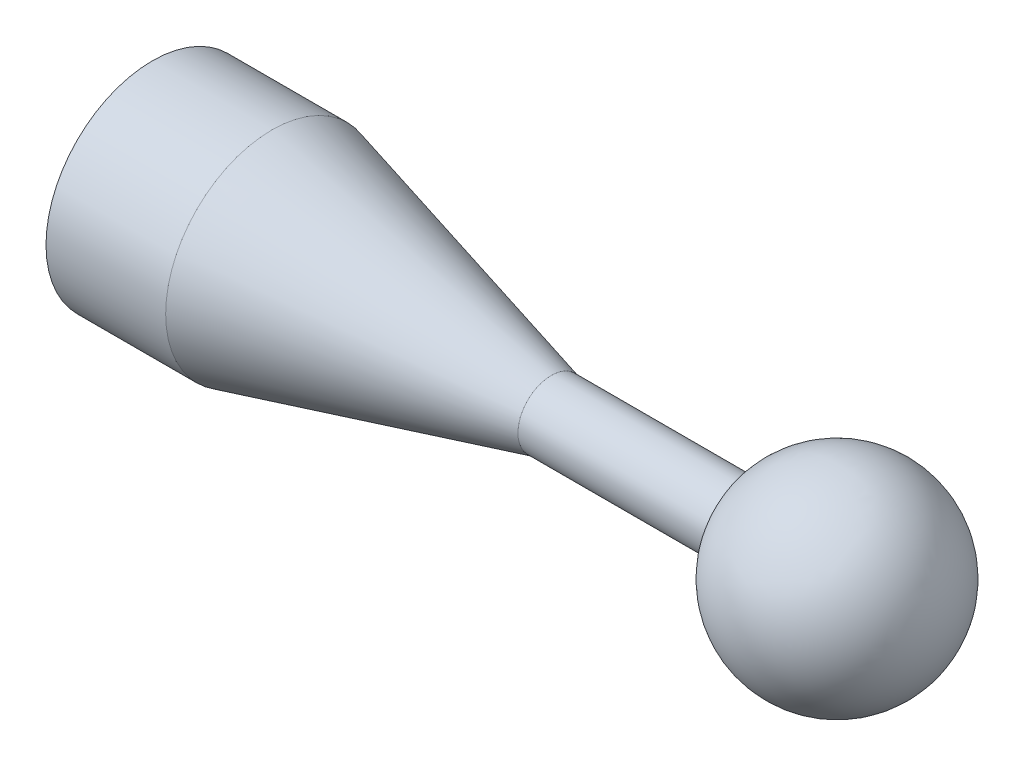
ISO-10303-21;
HEADER;
FILE_DESCRIPTION(('STEP AP214'),'2;1');
FILE_NAME('part.step','',(''),(''),'','','');
FILE_SCHEMA(('AUTOMOTIVE_DESIGN { 1 0 10303 214 1 1 1 1 }'));
ENDSEC;
DATA;
#1=APPLICATION_CONTEXT('core data for automotive mechanical design processes');
#2=APPLICATION_PROTOCOL_DEFINITION('international standard','automotive_design',2000,#1);
#3=PRODUCT_CONTEXT('',#1,'mechanical');
#4=PRODUCT('Part','Part','',(#3));
#5=PRODUCT_RELATED_PRODUCT_CATEGORY('part','',(#4));
#6=PRODUCT_DEFINITION_FORMATION('','',#4);
#7=PRODUCT_DEFINITION_CONTEXT('part definition',#1,'design');
#8=PRODUCT_DEFINITION('design','',#6,#7);
#9=PRODUCT_DEFINITION_SHAPE('','',#8);
#10=(LENGTH_UNIT() NAMED_UNIT(*) SI_UNIT(.MILLI.,.METRE.));
#11=(NAMED_UNIT(*) PLANE_ANGLE_UNIT() SI_UNIT($,.RADIAN.));
#12=(NAMED_UNIT(*) SI_UNIT($,.STERADIAN.) SOLID_ANGLE_UNIT());
#13=UNCERTAINTY_MEASURE_WITH_UNIT(LENGTH_MEASURE(1.E-05),#10,'distance_accuracy_value','');
#14=(GEOMETRIC_REPRESENTATION_CONTEXT(3) GLOBAL_UNCERTAINTY_ASSIGNED_CONTEXT((#13)) GLOBAL_UNIT_ASSIGNED_CONTEXT((#10,
#11,#12)) REPRESENTATION_CONTEXT('',''));
#15=CARTESIAN_POINT('',(0.,0.,0.));
#16=DIRECTION('',(0.,0.,1.));
#17=DIRECTION('',(1.,0.,0.));
#18=AXIS2_PLACEMENT_3D('',#15,#16,#17);
#19=CARTESIAN_POINT('',(103.,0.,0.));
#20=DIRECTION('',(-1.,0.,0.));
#21=DIRECTION('',(0.,1.,0.));
#22=AXIS2_PLACEMENT_3D('',#19,#20,#21);
#23=SPHERICAL_SURFACE('',#22,15.);
#24=CARTESIAN_POINT('',(88.857864376269,0.,0.));
#25=DIRECTION('',(-1.,0.,0.));
#26=DIRECTION('',(0.,0.,1.));
#27=AXIS2_PLACEMENT_3D('',#24,#25,#26);
#28=CIRCLE('',#27,5.);
#29=CARTESIAN_POINT('',(88.857864376269,0.,5.));
#30=VERTEX_POINT('',#29);
#31=EDGE_CURVE('E10',#30,#30,#28,.T.);
#32=ORIENTED_EDGE('',*,*,#31,.F.);
#33=EDGE_LOOP('',(#32));
#34=FACE_BOUND('',#33,.T.);
#35=ADVANCED_FACE('F29',(#34),#23,.T.);
#36=CARTESIAN_POINT('',(-11.8977150537634,0.,0.));
#37=DIRECTION('',(-1.,0.,0.));
#38=DIRECTION('',(0.,0.,1.));
#39=AXIS2_PLACEMENT_3D('',#36,#37,#38);
#40=CYLINDRICAL_SURFACE('',#39,5.);
#41=CARTESIAN_POINT('',(60.,0.,0.));
#42=DIRECTION('',(-1.,0.,0.));
#43=DIRECTION('',(0.,0.,1.));
#44=AXIS2_PLACEMENT_3D('',#41,#42,#43);
#45=CIRCLE('',#44,5.);
#46=CARTESIAN_POINT('',(60.,0.,5.));
#47=VERTEX_POINT('',#46);
#48=EDGE_CURVE('E35',#47,#47,#45,.T.);
#49=ORIENTED_EDGE('',*,*,#48,.F.);
#50=EDGE_LOOP('',(#49));
#51=FACE_BOUND('',#50,.T.);
#52=ORIENTED_EDGE('',*,*,#31,.T.);
#53=EDGE_LOOP('',(#52));
#54=FACE_BOUND('',#53,.T.);
#55=ADVANCED_FACE('F59',(#51,#54),#40,.T.);
#56=CARTESIAN_POINT('',(60.,0.,0.));
#57=DIRECTION('',(-1.,0.,0.));
#58=DIRECTION('',(0.,0.,1.));
#59=AXIS2_PLACEMENT_3D('',#56,#57,#58);
#60=CONICAL_SURFACE('',#59,5.,0.256151382565603);
#61=CARTESIAN_POINT('',(18.,0.,0.));
#62=DIRECTION('',(-1.,0.,0.));
#63=DIRECTION('',(0.,0.,1.));
#64=AXIS2_PLACEMENT_3D('',#61,#62,#63);
#65=CIRCLE('',#64,16.);
#66=CARTESIAN_POINT('',(18.,0.,16.));
#67=VERTEX_POINT('',#66);
#68=EDGE_CURVE('E39',#67,#67,#65,.T.);
#69=CARTESIAN_POINT('',(18.,0.,16.));
#70=CARTESIAN_POINT('',(18.4375,0.,15.8854166666667));
#71=CARTESIAN_POINT('',(18.875,0.,15.7708333333333));
#72=CARTESIAN_POINT('',(19.75,0.,15.5416666666667));
#73=CARTESIAN_POINT('',(20.1875,0.,15.4270833333333));
#74=CARTESIAN_POINT('',(21.0625,0.,15.1979166666667));
#75=CARTESIAN_POINT('',(21.5,0.,15.0833333333333));
#76=CARTESIAN_POINT('',(22.375,0.,14.8541666666667));
#77=CARTESIAN_POINT('',(22.8125,0.,14.7395833333333));
#78=CARTESIAN_POINT('',(23.6875,0.,14.5104166666667));
#79=CARTESIAN_POINT('',(24.125,0.,14.3958333333333));
#80=CARTESIAN_POINT('',(25.,0.,14.1666666666667));
#81=CARTESIAN_POINT('',(25.4375,0.,14.0520833333333));
#82=CARTESIAN_POINT('',(26.3125,0.,13.8229166666667));
#83=CARTESIAN_POINT('',(26.75,0.,13.7083333333333));
#84=CARTESIAN_POINT('',(27.625,0.,13.4791666666667));
#85=CARTESIAN_POINT('',(28.0625,0.,13.3645833333333));
#86=CARTESIAN_POINT('',(28.9375,0.,13.1354166666667));
#87=CARTESIAN_POINT('',(29.375,0.,13.0208333333333));
#88=CARTESIAN_POINT('',(30.25,0.,12.7916666666667));
#89=CARTESIAN_POINT('',(30.6875,0.,12.6770833333333));
#90=CARTESIAN_POINT('',(31.5625,0.,12.4479166666667));
#91=CARTESIAN_POINT('',(32.,0.,12.3333333333333));
#92=CARTESIAN_POINT('',(32.875,0.,12.1041666666667));
#93=CARTESIAN_POINT('',(33.3125,0.,11.9895833333333));
#94=CARTESIAN_POINT('',(34.1875,0.,11.7604166666667));
#95=CARTESIAN_POINT('',(34.625,0.,11.6458333333333));
#96=CARTESIAN_POINT('',(35.5,0.,11.4166666666667));
#97=CARTESIAN_POINT('',(35.9375,0.,11.3020833333333));
#98=CARTESIAN_POINT('',(36.8125,0.,11.0729166666667));
#99=CARTESIAN_POINT('',(37.25,0.,10.9583333333333));
#100=CARTESIAN_POINT('',(38.125,0.,10.7291666666667));
#101=CARTESIAN_POINT('',(38.5625,0.,10.6145833333333));
#102=CARTESIAN_POINT('',(39.4375,0.,10.3854166666667));
#103=CARTESIAN_POINT('',(39.875,0.,10.2708333333333));
#104=CARTESIAN_POINT('',(40.75,0.,10.0416666666667));
#105=CARTESIAN_POINT('',(41.1875,0.,9.92708333333333));
#106=CARTESIAN_POINT('',(42.0625,0.,9.69791666666667));
#107=CARTESIAN_POINT('',(42.5,0.,9.58333333333333));
#108=CARTESIAN_POINT('',(43.375,0.,9.35416666666666));
#109=CARTESIAN_POINT('',(43.8125,0.,9.23958333333333));
#110=CARTESIAN_POINT('',(44.6875,0.,9.01041666666666));
#111=CARTESIAN_POINT('',(45.125,0.,8.89583333333333));
#112=CARTESIAN_POINT('',(46.,0.,8.66666666666667));
#113=CARTESIAN_POINT('',(46.4375,0.,8.55208333333333));
#114=CARTESIAN_POINT('',(47.3125,0.,8.32291666666666));
#115=CARTESIAN_POINT('',(47.75,0.,8.20833333333333));
#116=CARTESIAN_POINT('',(48.625,0.,7.97916666666667));
#117=CARTESIAN_POINT('',(49.0625,0.,7.86458333333333));
#118=CARTESIAN_POINT('',(49.9375,0.,7.63541666666667));
#119=CARTESIAN_POINT('',(50.375,0.,7.52083333333333));
#120=CARTESIAN_POINT('',(51.25,0.,7.29166666666667));
#121=CARTESIAN_POINT('',(51.6875,0.,7.17708333333333));
#122=CARTESIAN_POINT('',(52.5625,0.,6.94791666666666));
#123=CARTESIAN_POINT('',(53.,0.,6.83333333333333));
#124=CARTESIAN_POINT('',(53.875,0.,6.60416666666666));
#125=CARTESIAN_POINT('',(54.3125,0.,6.48958333333333));
#126=CARTESIAN_POINT('',(55.1875,0.,6.26041666666667));
#127=CARTESIAN_POINT('',(55.625,0.,6.14583333333333));
#128=CARTESIAN_POINT('',(56.5,0.,5.91666666666667));
#129=CARTESIAN_POINT('',(56.9375,0.,5.80208333333333));
#130=CARTESIAN_POINT('',(57.8125,0.,5.57291666666667));
#131=CARTESIAN_POINT('',(58.25,0.,5.45833333333333));
#132=CARTESIAN_POINT('',(59.125,0.,5.22916666666667));
#133=CARTESIAN_POINT('',(59.5625,0.,5.11458333333333));
#134=CARTESIAN_POINT('',(60.,0.,5.));
#135=B_SPLINE_CURVE_WITH_KNOTS('',3,(#69,#70,#71,#72,#73,#74,#75,#76,#77,#78,#79,#80,#81,#82,
#83,#84,#85,#86,#87,#88,#89,#90,#91,#92,#93,#94,#95,#96,#97,#98,#99,#100,#101,#102,#103,#104,
#105,#106,#107,#108,#109,#110,#111,#112,#113,#114,#115,#116,#117,#118,#119,#120,#121,#122,#123,
#124,#125,#126,#127,#128,#129,#130,#131,#132,#133,#134),.UNSPECIFIED.,.F.,.F.,(4,2,2,2,2,2,2,2,
2,2,2,2,2,2,2,2,2,2,2,2,2,2,2,2,2,2,2,2,2,2,2,2,4),(0.,1.35676833413078,2.71353666826155,
4.07030500239232,5.4270733365231,6.78384167065388,8.14061000478465,9.49737833891543,
10.8541466730462,12.210915007177,13.5676833413078,14.9244516754385,16.2812200095693,
17.6379883437001,18.9947566778309,20.3515250119616,21.7082933460924,23.0650616802232,
24.421830014354,25.7785983484847,27.1353666826155,28.4921350167463,29.8489033508771,
31.2056716850078,32.5624400191386,33.9192083532694,35.2759766874002,36.632745021531,
37.9895133556617,39.3462816897925,40.7030500239233,42.0598183580541,43.4165866921848),.UNSPECIFIED.);
#136=EDGE_CURVE('BSEAM54',#67,#47,#135,.T.);
#137=ORIENTED_EDGE('',*,*,#68,.F.);
#138=ORIENTED_EDGE('',*,*,#48,.T.);
#139=ORIENTED_EDGE('',*,*,#136,.T.);
#140=ORIENTED_EDGE('',*,*,#136,.F.);
#141=EDGE_LOOP('',(#137,#139,#138,#140));
#142=FACE_BOUND('',#141,.T.);
#143=ADVANCED_FACE('F54',(#142),#60,.T.);
#144=CARTESIAN_POINT('',(-11.8977150537634,0.,0.));
#145=DIRECTION('',(-1.,0.,0.));
#146=DIRECTION('',(0.,0.,1.));
#147=AXIS2_PLACEMENT_3D('',#144,#145,#146);
#148=CYLINDRICAL_SURFACE('',#147,16.);
#149=CARTESIAN_POINT('',(0.,0.,0.));
#150=DIRECTION('',(-1.,0.,0.));
#151=DIRECTION('',(0.,0.,1.));
#152=AXIS2_PLACEMENT_3D('',#149,#150,#151);
#153=CIRCLE('',#152,16.);
#154=CARTESIAN_POINT('',(0.,0.,16.));
#155=VERTEX_POINT('',#154);
#156=EDGE_CURVE('E43',#155,#155,#153,.T.);
#157=ORIENTED_EDGE('',*,*,#156,.F.);
#158=EDGE_LOOP('',(#157));
#159=FACE_BOUND('',#158,.T.);
#160=ORIENTED_EDGE('',*,*,#68,.T.);
#161=EDGE_LOOP('',(#160));
#162=FACE_BOUND('',#161,.T.);
#163=ADVANCED_FACE('F51',(#159,#162),#148,.T.);
#164=CARTESIAN_POINT('',(0.,0.,0.));
#165=DIRECTION('',(1.,0.,0.));
#166=DIRECTION('',(0.,0.,-1.));
#167=AXIS2_PLACEMENT_3D('',#164,#165,#166);
#168=PLANE('',#167);
#169=ORIENTED_EDGE('',*,*,#156,.T.);
#170=EDGE_LOOP('',(#169));
#171=FACE_BOUND('',#170,.T.);
#172=ADVANCED_FACE('F49',(#171),#168,.F.);
#173=CLOSED_SHELL('',(#35,#55,#143,#163,#172));
#174=MANIFOLD_SOLID_BREP('B2',#173);
#175=ADVANCED_BREP_SHAPE_REPRESENTATION('',(#18,#174),#14);
#176=SHAPE_DEFINITION_REPRESENTATION(#9,#175);
ENDSEC;
END-ISO-10303-21;
